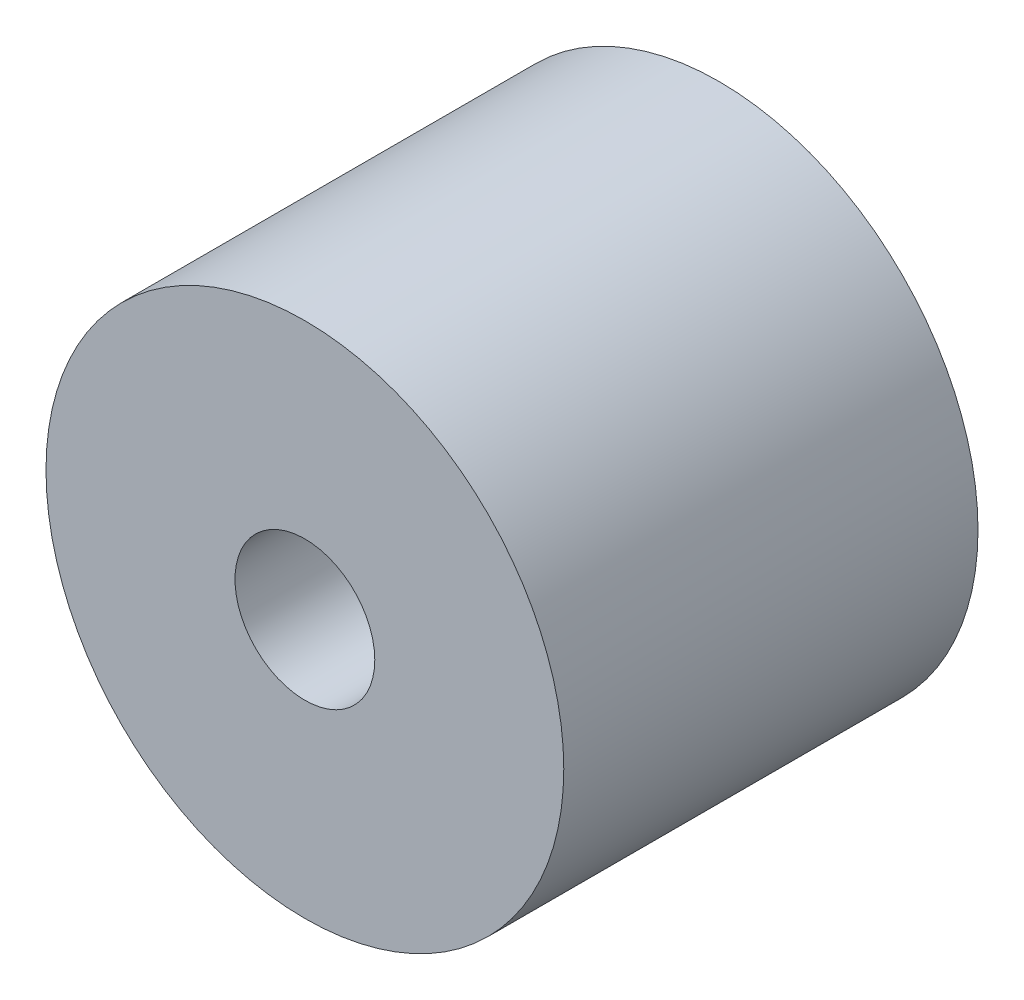
ISO-10303-21;
HEADER;
FILE_DESCRIPTION(('STEP AP214'),'2;1');
FILE_NAME('part.step','',(''),(''),'','','');
FILE_SCHEMA(('AUTOMOTIVE_DESIGN { 1 0 10303 214 1 1 1 1 }'));
ENDSEC;
DATA;
#1=APPLICATION_CONTEXT('core data for automotive mechanical design processes');
#2=APPLICATION_PROTOCOL_DEFINITION('international standard','automotive_design',2000,#1);
#3=PRODUCT_CONTEXT('',#1,'mechanical');
#4=PRODUCT('Part','Part','',(#3));
#5=PRODUCT_RELATED_PRODUCT_CATEGORY('part','',(#4));
#6=PRODUCT_DEFINITION_FORMATION('','',#4);
#7=PRODUCT_DEFINITION_CONTEXT('part definition',#1,'design');
#8=PRODUCT_DEFINITION('design','',#6,#7);
#9=PRODUCT_DEFINITION_SHAPE('','',#8);
#10=(LENGTH_UNIT() NAMED_UNIT(*) SI_UNIT(.MILLI.,.METRE.));
#11=(NAMED_UNIT(*) PLANE_ANGLE_UNIT() SI_UNIT($,.RADIAN.));
#12=(NAMED_UNIT(*) SI_UNIT($,.STERADIAN.) SOLID_ANGLE_UNIT());
#13=UNCERTAINTY_MEASURE_WITH_UNIT(LENGTH_MEASURE(1.E-05),#10,'distance_accuracy_value','');
#14=(GEOMETRIC_REPRESENTATION_CONTEXT(3) GLOBAL_UNCERTAINTY_ASSIGNED_CONTEXT((#13)) GLOBAL_UNIT_ASSIGNED_CONTEXT((#10,
#11,#12)) REPRESENTATION_CONTEXT('',''));
#15=CARTESIAN_POINT('',(0.,0.,0.));
#16=DIRECTION('',(0.,0.,1.));
#17=DIRECTION('',(1.,0.,0.));
#18=AXIS2_PLACEMENT_3D('',#15,#16,#17);
#19=CARTESIAN_POINT('',(0.,0.,10.16));
#20=DIRECTION('',(0.,0.,-1.));
#21=DIRECTION('',(-1.,0.,0.));
#22=AXIS2_PLACEMENT_3D('',#19,#20,#21);
#23=CYLINDRICAL_SURFACE('',#22,6.35);
#24=CARTESIAN_POINT('',(0.,0.,10.16));
#25=DIRECTION('',(0.,0.,1.));
#26=DIRECTION('',(1.,0.,0.));
#27=AXIS2_PLACEMENT_3D('',#24,#25,#26);
#28=CIRCLE('',#27,6.35);
#29=CARTESIAN_POINT('',(6.35,0.,10.16));
#30=VERTEX_POINT('',#29);
#31=EDGE_CURVE('E10',#30,#30,#28,.T.);
#32=ORIENTED_EDGE('',*,*,#31,.F.);
#33=EDGE_LOOP('',(#32));
#34=FACE_BOUND('',#33,.T.);
#35=CARTESIAN_POINT('',(0.,0.,0.));
#36=DIRECTION('',(0.,0.,1.));
#37=DIRECTION('',(1.,0.,0.));
#38=AXIS2_PLACEMENT_3D('',#35,#36,#37);
#39=CIRCLE('',#38,6.35);
#40=CARTESIAN_POINT('',(6.35,0.,0.));
#41=VERTEX_POINT('',#40);
#42=EDGE_CURVE('E36',#41,#41,#39,.T.);
#43=ORIENTED_EDGE('',*,*,#42,.T.);
#44=EDGE_LOOP('',(#43));
#45=FACE_BOUND('',#44,.T.);
#46=ADVANCED_FACE('F33',(#34,#45),#23,.T.);
#47=CARTESIAN_POINT('',(0.,0.,10.16));
#48=DIRECTION('',(0.,0.,1.));
#49=DIRECTION('',(1.,0.,0.));
#50=AXIS2_PLACEMENT_3D('',#47,#48,#49);
#51=PLANE('',#50);
#52=CARTESIAN_POINT('',(0.,0.,10.16));
#53=DIRECTION('',(0.,0.,1.));
#54=DIRECTION('',(1.,0.,0.));
#55=AXIS2_PLACEMENT_3D('',#52,#53,#54);
#56=CIRCLE('',#55,1.7145);
#57=CARTESIAN_POINT('',(1.7145,0.,10.16));
#58=VERTEX_POINT('',#57);
#59=EDGE_CURVE('E47',#58,#58,#56,.T.);
#60=ORIENTED_EDGE('',*,*,#59,.F.);
#61=EDGE_LOOP('',(#60));
#62=FACE_BOUND('',#61,.T.);
#63=ORIENTED_EDGE('',*,*,#31,.T.);
#64=EDGE_LOOP('',(#63));
#65=FACE_BOUND('',#64,.T.);
#66=ADVANCED_FACE('F53',(#62,#65),#51,.T.);
#67=CARTESIAN_POINT('',(0.,0.,0.));
#68=DIRECTION('',(0.,0.,1.));
#69=DIRECTION('',(1.,0.,0.));
#70=AXIS2_PLACEMENT_3D('',#67,#68,#69);
#71=PLANE('',#70);
#72=CARTESIAN_POINT('',(0.,0.,0.));
#73=DIRECTION('',(0.,0.,1.));
#74=DIRECTION('',(1.,0.,0.));
#75=AXIS2_PLACEMENT_3D('',#72,#73,#74);
#76=CIRCLE('',#75,1.7145);
#77=CARTESIAN_POINT('',(1.7145,0.,0.));
#78=VERTEX_POINT('',#77);
#79=EDGE_CURVE('E43',#78,#78,#76,.T.);
#80=ORIENTED_EDGE('',*,*,#79,.T.);
#81=EDGE_LOOP('',(#80));
#82=FACE_BOUND('',#81,.T.);
#83=ORIENTED_EDGE('',*,*,#42,.F.);
#84=EDGE_LOOP('',(#83));
#85=FACE_BOUND('',#84,.T.);
#86=ADVANCED_FACE('F55',(#82,#85),#71,.F.);
#87=CARTESIAN_POINT('',(0.,0.,10.16));
#88=DIRECTION('',(0.,0.,1.));
#89=DIRECTION('',(1.,0.,0.));
#90=AXIS2_PLACEMENT_3D('',#87,#88,#89);
#91=CYLINDRICAL_SURFACE('',#90,1.7145);
#92=ORIENTED_EDGE('',*,*,#79,.F.);
#93=EDGE_LOOP('',(#92));
#94=FACE_BOUND('',#93,.T.);
#95=ORIENTED_EDGE('',*,*,#59,.T.);
#96=EDGE_LOOP('',(#95));
#97=FACE_BOUND('',#96,.T.);
#98=ADVANCED_FACE('F51',(#94,#97),#91,.F.);
#99=CLOSED_SHELL('',(#46,#66,#86,#98));
#100=MANIFOLD_SOLID_BREP('B2',#99);
#101=ADVANCED_BREP_SHAPE_REPRESENTATION('',(#18,#100),#14);
#102=SHAPE_DEFINITION_REPRESENTATION(#9,#101);
ENDSEC;
END-ISO-10303-21;
